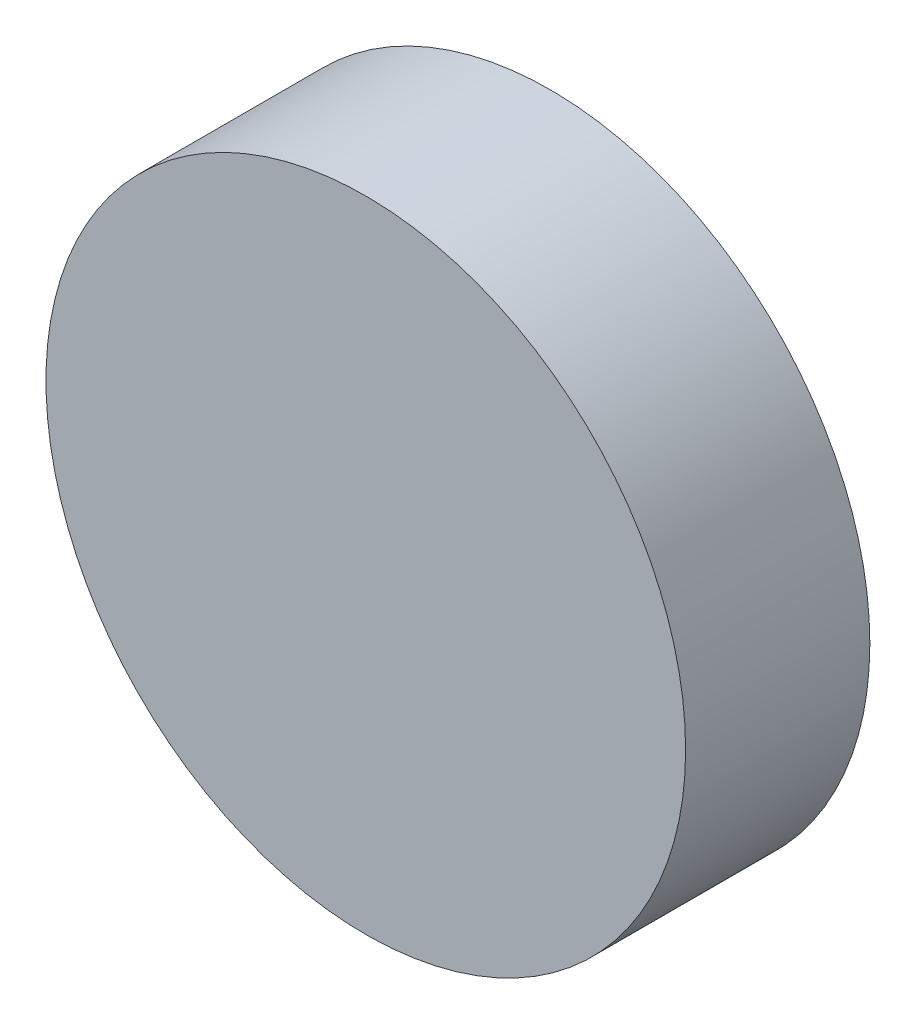
ISO-10303-21;
HEADER;
FILE_DESCRIPTION(('STEP AP214'),'2;1');
FILE_NAME('part.step','',(''),(''),'','','');
FILE_SCHEMA(('AUTOMOTIVE_DESIGN { 1 0 10303 214 1 1 1 1 }'));
ENDSEC;
DATA;
#1=APPLICATION_CONTEXT('core data for automotive mechanical design processes');
#2=APPLICATION_PROTOCOL_DEFINITION('international standard','automotive_design',2000,#1);
#3=PRODUCT_CONTEXT('',#1,'mechanical');
#4=PRODUCT('Part','Part','',(#3));
#5=PRODUCT_RELATED_PRODUCT_CATEGORY('part','',(#4));
#6=PRODUCT_DEFINITION_FORMATION('','',#4);
#7=PRODUCT_DEFINITION_CONTEXT('part definition',#1,'design');
#8=PRODUCT_DEFINITION('design','',#6,#7);
#9=PRODUCT_DEFINITION_SHAPE('','',#8);
#10=(LENGTH_UNIT() NAMED_UNIT(*) SI_UNIT(.MILLI.,.METRE.));
#11=(NAMED_UNIT(*) PLANE_ANGLE_UNIT() SI_UNIT($,.RADIAN.));
#12=(NAMED_UNIT(*) SI_UNIT($,.STERADIAN.) SOLID_ANGLE_UNIT());
#13=UNCERTAINTY_MEASURE_WITH_UNIT(LENGTH_MEASURE(1.E-05),#10,'distance_accuracy_value','');
#14=(GEOMETRIC_REPRESENTATION_CONTEXT(3) GLOBAL_UNCERTAINTY_ASSIGNED_CONTEXT((#13)) GLOBAL_UNIT_ASSIGNED_CONTEXT((#10,
#11,#12)) REPRESENTATION_CONTEXT('',''));
#15=CARTESIAN_POINT('',(0.,0.,0.));
#16=DIRECTION('',(0.,0.,1.));
#17=DIRECTION('',(1.,0.,0.));
#18=AXIS2_PLACEMENT_3D('',#15,#16,#17);
#19=CARTESIAN_POINT('',(0.,0.,4.572));
#20=DIRECTION('',(0.,0.,-1.));
#21=DIRECTION('',(-1.,0.,0.));
#22=AXIS2_PLACEMENT_3D('',#19,#20,#21);
#23=CYLINDRICAL_SURFACE('',#22,7.9375);
#24=CARTESIAN_POINT('',(0.,0.,4.572));
#25=DIRECTION('',(0.,0.,1.));
#26=DIRECTION('',(1.,0.,0.));
#27=AXIS2_PLACEMENT_3D('',#24,#25,#26);
#28=CIRCLE('',#27,7.9375);
#29=CARTESIAN_POINT('',(7.9375,0.,4.572));
#30=VERTEX_POINT('',#29);
#31=EDGE_CURVE('E10',#30,#30,#28,.T.);
#32=ORIENTED_EDGE('',*,*,#31,.F.);
#33=EDGE_LOOP('',(#32));
#34=FACE_BOUND('',#33,.T.);
#35=CARTESIAN_POINT('',(0.,0.,0.));
#36=DIRECTION('',(0.,0.,1.));
#37=DIRECTION('',(1.,0.,0.));
#38=AXIS2_PLACEMENT_3D('',#35,#36,#37);
#39=CIRCLE('',#38,7.9375);
#40=CARTESIAN_POINT('',(7.9375,0.,0.));
#41=VERTEX_POINT('',#40);
#42=EDGE_CURVE('E34',#41,#41,#39,.T.);
#43=ORIENTED_EDGE('',*,*,#42,.T.);
#44=EDGE_LOOP('',(#43));
#45=FACE_BOUND('',#44,.T.);
#46=ADVANCED_FACE('F31',(#34,#45),#23,.T.);
#47=CARTESIAN_POINT('',(0.,0.,4.572));
#48=DIRECTION('',(0.,0.,1.));
#49=DIRECTION('',(1.,0.,0.));
#50=AXIS2_PLACEMENT_3D('',#47,#48,#49);
#51=PLANE('',#50);
#52=ORIENTED_EDGE('',*,*,#31,.T.);
#53=EDGE_LOOP('',(#52));
#54=FACE_BOUND('',#53,.T.);
#55=ADVANCED_FACE('F46',(#54),#51,.T.);
#56=CARTESIAN_POINT('',(0.,0.,0.));
#57=DIRECTION('',(0.,0.,1.));
#58=DIRECTION('',(1.,0.,0.));
#59=AXIS2_PLACEMENT_3D('',#56,#57,#58);
#60=PLANE('',#59);
#61=ORIENTED_EDGE('',*,*,#42,.F.);
#62=EDGE_LOOP('',(#61));
#63=FACE_BOUND('',#62,.T.);
#64=ADVANCED_FACE('F44',(#63),#60,.F.);
#65=CLOSED_SHELL('',(#46,#55,#64));
#66=MANIFOLD_SOLID_BREP('B2',#65);
#67=ADVANCED_BREP_SHAPE_REPRESENTATION('',(#18,#66),#14);
#68=SHAPE_DEFINITION_REPRESENTATION(#9,#67);
ENDSEC;
END-ISO-10303-21;
